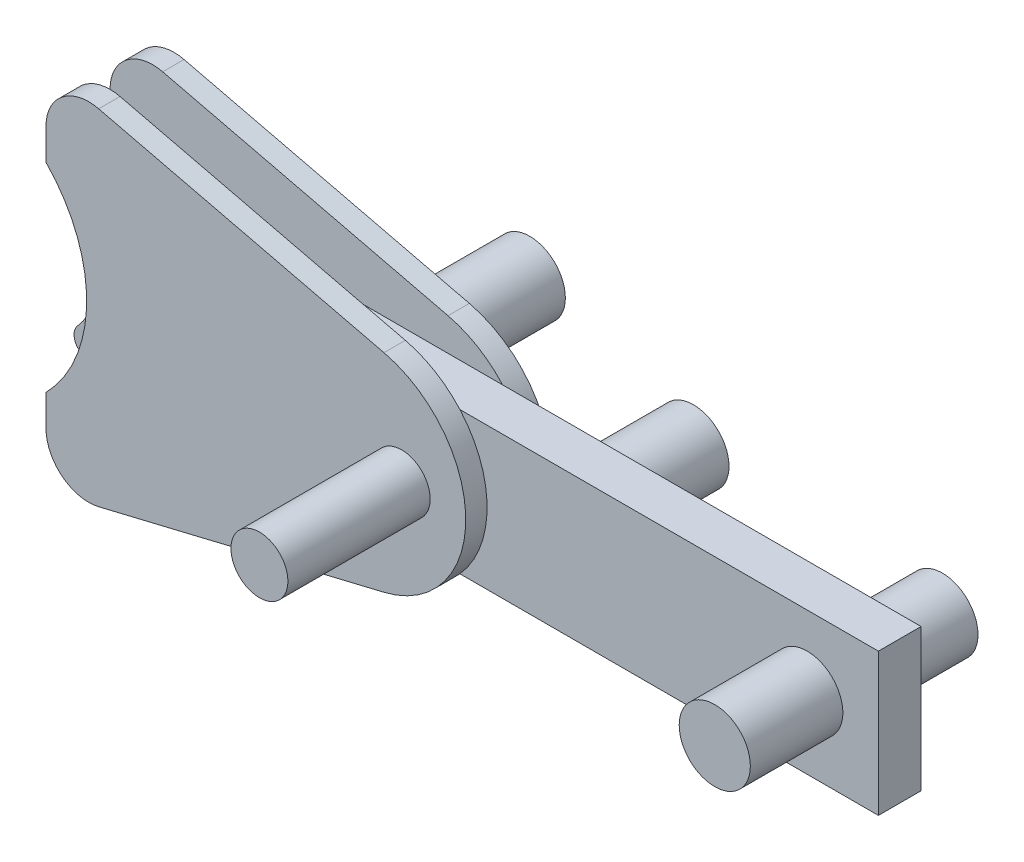
ISO-10303-21;
HEADER;
FILE_DESCRIPTION(('STEP AP214'),'2;1');
FILE_NAME('part.step','',(''),(''),'','','');
FILE_SCHEMA(('AUTOMOTIVE_DESIGN { 1 0 10303 214 1 1 1 1 }'));
ENDSEC;
DATA;
#1=APPLICATION_CONTEXT('core data for automotive mechanical design processes');
#2=APPLICATION_PROTOCOL_DEFINITION('international standard','automotive_design',2000,#1);
#3=PRODUCT_CONTEXT('',#1,'mechanical');
#4=PRODUCT('Part','Part','',(#3));
#5=PRODUCT_RELATED_PRODUCT_CATEGORY('part','',(#4));
#6=PRODUCT_DEFINITION_FORMATION('','',#4);
#7=PRODUCT_DEFINITION_CONTEXT('part definition',#1,'design');
#8=PRODUCT_DEFINITION('design','',#6,#7);
#9=PRODUCT_DEFINITION_SHAPE('','',#8);
#10=(LENGTH_UNIT() NAMED_UNIT(*) SI_UNIT(.MILLI.,.METRE.));
#11=(NAMED_UNIT(*) PLANE_ANGLE_UNIT() SI_UNIT($,.RADIAN.));
#12=(NAMED_UNIT(*) SI_UNIT($,.STERADIAN.) SOLID_ANGLE_UNIT());
#13=UNCERTAINTY_MEASURE_WITH_UNIT(LENGTH_MEASURE(1.E-05),#10,'distance_accuracy_value','');
#14=(GEOMETRIC_REPRESENTATION_CONTEXT(3) GLOBAL_UNCERTAINTY_ASSIGNED_CONTEXT((#13)) GLOBAL_UNIT_ASSIGNED_CONTEXT((#10,
#11,#12)) REPRESENTATION_CONTEXT('',''));
#15=CARTESIAN_POINT('',(0.,0.,0.));
#16=DIRECTION('',(0.,0.,1.));
#17=DIRECTION('',(1.,0.,0.));
#18=AXIS2_PLACEMENT_3D('',#15,#16,#17);
#19=CARTESIAN_POINT('',(-35.,0.,-1.5));
#20=DIRECTION('',(0.,0.,1.));
#21=DIRECTION('',(-1.,0.,0.));
#22=AXIS2_PLACEMENT_3D('',#19,#20,#21);
#23=PLANE('',#22);
#24=DIRECTION('',(1.,0.,0.));
#25=VECTOR('',#24,1.);
#26=CARTESIAN_POINT('',(-35.,-5.,-1.5));
#27=LINE('',#26,#25);
#28=CARTESIAN_POINT('',(-30.5278640450004,-5.,-1.5));
#29=VERTEX_POINT('',#28);
#30=CARTESIAN_POINT('',(-30.4811743906985,-5.,-1.5));
#31=VERTEX_POINT('',#30);
#32=EDGE_CURVE('E328',#29,#31,#27,.T.);
#33=ORIENTED_EDGE('',*,*,#32,.F.);
#34=CARTESIAN_POINT('',(-30.5278640450004,-4.,-1.5));
#35=DIRECTION('',(0.,0.,1.));
#36=DIRECTION('',(1.,0.,0.));
#37=AXIS2_PLACEMENT_3D('',#34,#35,#36);
#38=CIRCLE('',#37,1.);
#39=CARTESIAN_POINT('',(-31.2732200375004,-3.33333333333333,-1.5));
#40=VERTEX_POINT('',#39);
#41=EDGE_CURVE('E463',#29,#40,#38,.F.);
#42=ORIENTED_EDGE('',*,*,#41,.T.);
#43=CARTESIAN_POINT('',(-35.,0.,-1.5));
#44=DIRECTION('',(0.,0.,-1.));
#45=DIRECTION('',(-1.,0.,0.));
#46=AXIS2_PLACEMENT_3D('',#43,#44,#45);
#47=CIRCLE('',#46,5.);
#48=CARTESIAN_POINT('',(-31.2732200375004,3.33333333333333,-1.5));
#49=VERTEX_POINT('',#48);
#50=EDGE_CURVE('E331',#49,#40,#47,.T.);
#51=ORIENTED_EDGE('',*,*,#50,.F.);
#52=CARTESIAN_POINT('',(-30.5278640450004,4.,-1.5));
#53=DIRECTION('',(0.,0.,1.));
#54=DIRECTION('',(1.,0.,0.));
#55=AXIS2_PLACEMENT_3D('',#52,#53,#54);
#56=CIRCLE('',#55,1.);
#57=CARTESIAN_POINT('',(-30.5278640450004,5.,-1.5));
#58=VERTEX_POINT('',#57);
#59=EDGE_CURVE('E460',#49,#58,#56,.F.);
#60=ORIENTED_EDGE('',*,*,#59,.T.);
#61=DIRECTION('',(-1.,0.,0.));
#62=VECTOR('',#61,1.);
#63=CARTESIAN_POINT('',(-35.,5.,-1.5));
#64=LINE('',#63,#62);
#65=CARTESIAN_POINT('',(-30.4811743906985,5.,-1.5));
#66=VERTEX_POINT('',#65);
#67=EDGE_CURVE('E335',#66,#58,#64,.T.);
#68=ORIENTED_EDGE('',*,*,#67,.F.);
#69=CARTESIAN_POINT('',(-39.1414284285429,0.,-1.5));
#70=DIRECTION('',(0.,0.,-1.));
#71=DIRECTION('',(-1.,0.,0.));
#72=AXIS2_PLACEMENT_3D('',#69,#70,#71);
#73=CIRCLE('',#72,10.);
#74=EDGE_CURVE('E276',#66,#31,#73,.T.);
#75=ORIENTED_EDGE('',*,*,#74,.T.);
#76=EDGE_LOOP('',(#33,#42,#51,#60,#68,#75));
#77=FACE_BOUND('',#76,.T.);
#78=ADVANCED_FACE('F39',(#77),#23,.F.);
#79=CARTESIAN_POINT('',(-35.,0.,1.5));
#80=DIRECTION('',(0.,0.,-1.));
#81=DIRECTION('',(-1.,0.,0.));
#82=AXIS2_PLACEMENT_3D('',#79,#80,#81);
#83=PLANE('',#82);
#84=CARTESIAN_POINT('',(-35.,0.,1.5));
#85=DIRECTION('',(0.,0.,-1.));
#86=DIRECTION('',(-1.,0.,0.));
#87=AXIS2_PLACEMENT_3D('',#84,#85,#86);
#88=CIRCLE('',#87,5.);
#89=CARTESIAN_POINT('',(-31.2732200375004,3.33333333333333,1.5));
#90=VERTEX_POINT('',#89);
#91=CARTESIAN_POINT('',(-31.2732200375004,-3.33333333333333,1.5));
#92=VERTEX_POINT('',#91);
#93=EDGE_CURVE('E436',#90,#92,#88,.T.);
#94=ORIENTED_EDGE('',*,*,#93,.T.);
#95=CARTESIAN_POINT('',(-30.5278640450004,-4.,1.5));
#96=DIRECTION('',(0.,0.,-1.));
#97=DIRECTION('',(-1.,0.,0.));
#98=AXIS2_PLACEMENT_3D('',#95,#96,#97);
#99=CIRCLE('',#98,1.);
#100=CARTESIAN_POINT('',(-30.5278640450004,-5.,1.5));
#101=VERTEX_POINT('',#100);
#102=EDGE_CURVE('E475',#92,#101,#99,.F.);
#103=ORIENTED_EDGE('',*,*,#102,.T.);
#104=DIRECTION('',(1.,0.,0.));
#105=VECTOR('',#104,1.);
#106=CARTESIAN_POINT('',(-35.,-5.,1.5));
#107=LINE('',#106,#105);
#108=CARTESIAN_POINT('',(-30.4811743906985,-5.,1.5));
#109=VERTEX_POINT('',#108);
#110=EDGE_CURVE('E441',#101,#109,#107,.T.);
#111=ORIENTED_EDGE('',*,*,#110,.T.);
#112=CARTESIAN_POINT('',(-39.1414284285429,0.,1.5));
#113=DIRECTION('',(0.,0.,-1.));
#114=DIRECTION('',(-1.,0.,0.));
#115=AXIS2_PLACEMENT_3D('',#112,#113,#114);
#116=CIRCLE('',#115,10.);
#117=CARTESIAN_POINT('',(-30.4811743906985,5.,1.5));
#118=VERTEX_POINT('',#117);
#119=EDGE_CURVE('E374',#118,#109,#116,.T.);
#120=ORIENTED_EDGE('',*,*,#119,.F.);
#121=DIRECTION('',(-1.,0.,0.));
#122=VECTOR('',#121,1.);
#123=CARTESIAN_POINT('',(-35.,5.,1.5));
#124=LINE('',#123,#122);
#125=CARTESIAN_POINT('',(-30.5278640450004,5.,1.5));
#126=VERTEX_POINT('',#125);
#127=EDGE_CURVE('E432',#118,#126,#124,.T.);
#128=ORIENTED_EDGE('',*,*,#127,.T.);
#129=CARTESIAN_POINT('',(-30.5278640450004,4.,1.5));
#130=DIRECTION('',(0.,0.,-1.));
#131=DIRECTION('',(-1.,0.,0.));
#132=AXIS2_PLACEMENT_3D('',#129,#130,#131);
#133=CIRCLE('',#132,1.);
#134=EDGE_CURVE('E472',#126,#90,#133,.F.);
#135=ORIENTED_EDGE('',*,*,#134,.T.);
#136=EDGE_LOOP('',(#94,#103,#111,#120,#128,#135));
#137=FACE_BOUND('',#136,.T.);
#138=ADVANCED_FACE('F505',(#137),#83,.F.);
#139=CARTESIAN_POINT('',(25.,5.00000000000001,1.5));
#140=DIRECTION('',(-1.,0.,0.));
#141=DIRECTION('',(0.,0.,1.));
#142=AXIS2_PLACEMENT_3D('',#139,#140,#141);
#143=PLANE('',#142);
#144=DIRECTION('',(0.,0.,-1.));
#145=VECTOR('',#144,1.);
#146=CARTESIAN_POINT('',(25.,-4.99999999999999,1.5));
#147=LINE('',#146,#145);
#148=CARTESIAN_POINT('',(25.,-4.99999999999999,1.5));
#149=VERTEX_POINT('',#148);
#150=CARTESIAN_POINT('',(25.,-4.99999999999999,-1.5));
#151=VERTEX_POINT('',#150);
#152=EDGE_CURVE('E444',#149,#151,#147,.T.);
#153=ORIENTED_EDGE('',*,*,#152,.T.);
#154=DIRECTION('',(0.,1.,0.));
#155=VECTOR('',#154,1.);
#156=CARTESIAN_POINT('',(25.,5.00000000000001,-1.5));
#157=LINE('',#156,#155);
#158=CARTESIAN_POINT('',(25.,5.00000000000001,-1.5));
#159=VERTEX_POINT('',#158);
#160=EDGE_CURVE('E230',#151,#159,#157,.T.);
#161=ORIENTED_EDGE('',*,*,#160,.T.);
#162=DIRECTION('',(0.,0.,-1.));
#163=VECTOR('',#162,1.);
#164=CARTESIAN_POINT('',(25.,5.00000000000001,1.5));
#165=LINE('',#164,#163);
#166=CARTESIAN_POINT('',(25.,5.00000000000001,1.5));
#167=VERTEX_POINT('',#166);
#168=EDGE_CURVE('E449',#167,#159,#165,.T.);
#169=ORIENTED_EDGE('',*,*,#168,.F.);
#170=DIRECTION('',(0.,1.,0.));
#171=VECTOR('',#170,1.);
#172=CARTESIAN_POINT('',(25.,5.00000000000001,1.5));
#173=LINE('',#172,#171);
#174=EDGE_CURVE('E428',#149,#167,#173,.T.);
#175=ORIENTED_EDGE('',*,*,#174,.F.);
#176=EDGE_LOOP('',(#153,#161,#169,#175));
#177=FACE_BOUND('',#176,.T.);
#178=ADVANCED_FACE('F512',(#177),#143,.F.);
#179=CARTESIAN_POINT('',(-35.,5.,1.5));
#180=DIRECTION('',(0.,-1.,0.));
#181=DIRECTION('',(1.,0.,0.));
#182=AXIS2_PLACEMENT_3D('',#179,#180,#181);
#183=PLANE('',#182);
#184=ORIENTED_EDGE('',*,*,#67,.T.);
#185=DIRECTION('',(0.,0.,-1.));
#186=VECTOR('',#185,1.);
#187=CARTESIAN_POINT('',(-30.5278640450004,5.,1.5));
#188=LINE('',#187,#186);
#189=EDGE_CURVE('E55',#58,#126,#188,.F.);
#190=ORIENTED_EDGE('',*,*,#189,.T.);
#191=ORIENTED_EDGE('',*,*,#127,.F.);
#192=CARTESIAN_POINT('',(-4.40983005625053,5.,1.5));
#193=VERTEX_POINT('',#192);
#194=EDGE_CURVE('E437',#193,#118,#124,.T.);
#195=ORIENTED_EDGE('',*,*,#194,.F.);
#196=EDGE_CURVE('E433',#167,#193,#124,.T.);
#197=ORIENTED_EDGE('',*,*,#196,.F.);
#198=ORIENTED_EDGE('',*,*,#168,.T.);
#199=CARTESIAN_POINT('',(-4.40983005625053,5.,-1.5));
#200=VERTEX_POINT('',#199);
#201=EDGE_CURVE('E336',#159,#200,#64,.T.);
#202=ORIENTED_EDGE('',*,*,#201,.T.);
#203=EDGE_CURVE('E341',#200,#66,#64,.T.);
#204=ORIENTED_EDGE('',*,*,#203,.T.);
#205=EDGE_LOOP('',(#184,#190,#191,#195,#197,#198,#202,#204));
#206=FACE_BOUND('',#205,.T.);
#207=ADVANCED_FACE('F682',(#206),#183,.F.);
#208=CARTESIAN_POINT('',(-35.,0.,1.5));
#209=DIRECTION('',(0.,0.,-1.));
#210=DIRECTION('',(-1.,0.,0.));
#211=AXIS2_PLACEMENT_3D('',#208,#209,#210);
#212=CYLINDRICAL_SURFACE('',#211,5.);
#213=ORIENTED_EDGE('',*,*,#50,.T.);
#214=DIRECTION('',(0.,0.,-1.));
#215=VECTOR('',#214,1.);
#216=CARTESIAN_POINT('',(-31.2732200375004,-3.33333333333333,1.5));
#217=LINE('',#216,#215);
#218=EDGE_CURVE('E63',#40,#92,#217,.F.);
#219=ORIENTED_EDGE('',*,*,#218,.T.);
#220=ORIENTED_EDGE('',*,*,#93,.F.);
#221=DIRECTION('',(0.,0.,-1.));
#222=VECTOR('',#221,1.);
#223=CARTESIAN_POINT('',(-31.2732200375004,3.33333333333333,1.5));
#224=LINE('',#223,#222);
#225=EDGE_CURVE('E466',#90,#49,#224,.T.);
#226=ORIENTED_EDGE('',*,*,#225,.T.);
#227=EDGE_LOOP('',(#213,#219,#220,#226));
#228=FACE_BOUND('',#227,.T.);
#229=ADVANCED_FACE('F686',(#228),#212,.F.);
#230=CARTESIAN_POINT('',(-35.,-5.,1.5));
#231=DIRECTION('',(0.,1.,0.));
#232=DIRECTION('',(-1.,0.,0.));
#233=AXIS2_PLACEMENT_3D('',#230,#231,#232);
#234=PLANE('',#233);
#235=ORIENTED_EDGE('',*,*,#110,.F.);
#236=DIRECTION('',(0.,0.,-1.));
#237=VECTOR('',#236,1.);
#238=CARTESIAN_POINT('',(-30.5278640450004,-5.,1.5));
#239=LINE('',#238,#237);
#240=EDGE_CURVE('E456',#101,#29,#239,.T.);
#241=ORIENTED_EDGE('',*,*,#240,.T.);
#242=ORIENTED_EDGE('',*,*,#32,.T.);
#243=CARTESIAN_POINT('',(-4.40983005625052,-5.,-1.5));
#244=VERTEX_POINT('',#243);
#245=EDGE_CURVE('E332',#31,#244,#27,.T.);
#246=ORIENTED_EDGE('',*,*,#245,.T.);
#247=EDGE_CURVE('E327',#244,#151,#27,.T.);
#248=ORIENTED_EDGE('',*,*,#247,.T.);
#249=ORIENTED_EDGE('',*,*,#152,.F.);
#250=CARTESIAN_POINT('',(-4.40983005625052,-5.,1.5));
#251=VERTEX_POINT('',#250);
#252=EDGE_CURVE('E440',#251,#149,#107,.T.);
#253=ORIENTED_EDGE('',*,*,#252,.F.);
#254=EDGE_CURVE('E445',#109,#251,#107,.T.);
#255=ORIENTED_EDGE('',*,*,#254,.F.);
#256=EDGE_LOOP('',(#235,#241,#242,#246,#248,#249,#253,#255));
#257=FACE_BOUND('',#256,.T.);
#258=ADVANCED_FACE('F547',(#257),#234,.F.);
#259=CARTESIAN_POINT('',(20.,0.,1.5));
#260=DIRECTION('',(0.,0.,-1.));
#261=DIRECTION('',(-1.,0.,0.));
#262=AXIS2_PLACEMENT_3D('',#259,#260,#261);
#263=CIRCLE('',#262,2.5);
#264=CARTESIAN_POINT('',(17.5,0.,1.5));
#265=VERTEX_POINT('',#264);
#266=EDGE_CURVE('E452',#265,#265,#263,.F.);
#267=ORIENTED_EDGE('',*,*,#266,.F.);
#268=EDGE_LOOP('',(#267));
#269=FACE_BOUND('',#268,.T.);
#270=CARTESIAN_POINT('',(-10.,0.,1.5));
#271=DIRECTION('',(0.,0.,1.));
#272=DIRECTION('',(1.,0.,0.));
#273=AXIS2_PLACEMENT_3D('',#270,#271,#272);
#274=CIRCLE('',#273,7.5);
#275=EDGE_CURVE('E389',#251,#193,#274,.T.);
#276=ORIENTED_EDGE('',*,*,#275,.F.);
#277=ORIENTED_EDGE('',*,*,#252,.T.);
#278=ORIENTED_EDGE('',*,*,#174,.T.);
#279=ORIENTED_EDGE('',*,*,#196,.T.);
#280=EDGE_LOOP('',(#276,#277,#278,#279));
#281=FACE_BOUND('',#280,.T.);
#282=ADVANCED_FACE('F515',(#269,#281),#83,.F.);
#283=CARTESIAN_POINT('',(-39.1414284285429,0.,1.5));
#284=DIRECTION('',(0.,0.,-1.));
#285=DIRECTION('',(-1.,0.,0.));
#286=AXIS2_PLACEMENT_3D('',#283,#284,#285);
#287=PLANE('',#286);
#288=CARTESIAN_POINT('',(-8.24766380925009,7.29241509203831,1.5));
#289=VERTEX_POINT('',#288);
#290=EDGE_CURVE('E383',#193,#289,#274,.T.);
#291=ORIENTED_EDGE('',*,*,#290,.F.);
#292=ORIENTED_EDGE('',*,*,#194,.T.);
#293=CARTESIAN_POINT('',(-32.,7.,1.5));
#294=VERTEX_POINT('',#293);
#295=EDGE_CURVE('E369',#294,#118,#116,.T.);
#296=ORIENTED_EDGE('',*,*,#295,.F.);
#297=DIRECTION('',(0.,-1.,0.));
#298=VECTOR('',#297,1.);
#299=CARTESIAN_POINT('',(-32.,7.,1.5));
#300=LINE('',#299,#298);
#301=CARTESIAN_POINT('',(-32.,9.19371522027673,1.5));
#302=VERTEX_POINT('',#301);
#303=EDGE_CURVE('E347',#302,#294,#300,.T.);
#304=ORIENTED_EDGE('',*,*,#303,.F.);
#305=CARTESIAN_POINT('',(-29.,9.19371522027673,1.5));
#306=DIRECTION('',(0.,0.,1.));
#307=DIRECTION('',(1.,0.,0.));
#308=AXIS2_PLACEMENT_3D('',#305,#306,#307);
#309=CIRCLE('',#308,3.);
#310=CARTESIAN_POINT('',(-28.2990655237,12.1106812570921,1.5));
#311=VERTEX_POINT('',#310);
#312=EDGE_CURVE('E392',#311,#302,#309,.T.);
#313=ORIENTED_EDGE('',*,*,#312,.F.);
#314=DIRECTION('',(-0.972322012271774,0.233644825433321,0.));
#315=VECTOR('',#314,1.);
#316=CARTESIAN_POINT('',(-28.2990655237,12.1106812570921,1.5));
#317=LINE('',#316,#315);
#318=EDGE_CURVE('E388',#289,#311,#317,.T.);
#319=ORIENTED_EDGE('',*,*,#318,.F.);
#320=EDGE_LOOP('',(#291,#292,#296,#304,#313,#319));
#321=FACE_BOUND('',#320,.T.);
#322=ADVANCED_FACE('F680',(#321),#287,.T.);
#323=CARTESIAN_POINT('',(-39.1414284285429,0.,3.));
#324=DIRECTION('',(0.,0.,-1.));
#325=DIRECTION('',(-1.,0.,0.));
#326=AXIS2_PLACEMENT_3D('',#323,#324,#325);
#327=CYLINDRICAL_SURFACE('',#326,10.);
#328=ORIENTED_EDGE('',*,*,#295,.T.);
#329=ORIENTED_EDGE('',*,*,#119,.T.);
#330=CARTESIAN_POINT('',(-32.,-7.,1.5));
#331=VERTEX_POINT('',#330);
#332=EDGE_CURVE('E340',#109,#331,#116,.T.);
#333=ORIENTED_EDGE('',*,*,#332,.T.);
#334=DIRECTION('',(0.,0.,-1.));
#335=VECTOR('',#334,1.);
#336=CARTESIAN_POINT('',(-32.,-7.,3.));
#337=LINE('',#336,#335);
#338=CARTESIAN_POINT('',(-32.,-7.,3.));
#339=VERTEX_POINT('',#338);
#340=EDGE_CURVE('E424',#339,#331,#337,.T.);
#341=ORIENTED_EDGE('',*,*,#340,.F.);
#342=CARTESIAN_POINT('',(-39.1414284285429,0.,3.));
#343=DIRECTION('',(0.,0.,-1.));
#344=DIRECTION('',(-1.,0.,0.));
#345=AXIS2_PLACEMENT_3D('',#342,#343,#344);
#346=CIRCLE('',#345,10.);
#347=CARTESIAN_POINT('',(-32.,7.,3.));
#348=VERTEX_POINT('',#347);
#349=EDGE_CURVE('E342',#348,#339,#346,.T.);
#350=ORIENTED_EDGE('',*,*,#349,.F.);
#351=DIRECTION('',(0.,0.,-1.));
#352=VECTOR('',#351,1.);
#353=CARTESIAN_POINT('',(-32.,7.,3.));
#354=LINE('',#353,#352);
#355=EDGE_CURVE('E368',#348,#294,#354,.T.);
#356=ORIENTED_EDGE('',*,*,#355,.T.);
#357=EDGE_LOOP('',(#328,#329,#333,#341,#350,#356));
#358=FACE_BOUND('',#357,.T.);
#359=ADVANCED_FACE('F645',(#358),#327,.F.);
#360=CARTESIAN_POINT('',(-32.,-9.19371522027672,3.));
#361=DIRECTION('',(1.,0.,0.));
#362=DIRECTION('',(0.,0.,-1.));
#363=AXIS2_PLACEMENT_3D('',#360,#361,#362);
#364=PLANE('',#363);
#365=DIRECTION('',(0.,-1.,0.));
#366=VECTOR('',#365,1.);
#367=CARTESIAN_POINT('',(-32.,-9.19371522027672,1.5));
#368=LINE('',#367,#366);
#369=CARTESIAN_POINT('',(-32.,-9.19371522027672,1.5));
#370=VERTEX_POINT('',#369);
#371=EDGE_CURVE('E373',#331,#370,#368,.T.);
#372=ORIENTED_EDGE('',*,*,#371,.T.);
#373=DIRECTION('',(0.,0.,-1.));
#374=VECTOR('',#373,1.);
#375=CARTESIAN_POINT('',(-32.,-9.19371522027672,3.));
#376=LINE('',#375,#374);
#377=CARTESIAN_POINT('',(-32.,-9.19371522027672,3.));
#378=VERTEX_POINT('',#377);
#379=EDGE_CURVE('E420',#378,#370,#376,.T.);
#380=ORIENTED_EDGE('',*,*,#379,.F.);
#381=DIRECTION('',(0.,-1.,0.));
#382=VECTOR('',#381,1.);
#383=CARTESIAN_POINT('',(-32.,-9.19371522027672,3.));
#384=LINE('',#383,#382);
#385=EDGE_CURVE('E346',#339,#378,#384,.T.);
#386=ORIENTED_EDGE('',*,*,#385,.F.);
#387=ORIENTED_EDGE('',*,*,#340,.T.);
#388=EDGE_LOOP('',(#372,#380,#386,#387));
#389=FACE_BOUND('',#388,.T.);
#390=ADVANCED_FACE('F649',(#389),#364,.F.);
#391=CARTESIAN_POINT('',(-29.,-9.19371522027672,3.));
#392=DIRECTION('',(0.,0.,-1.));
#393=DIRECTION('',(-1.,0.,0.));
#394=AXIS2_PLACEMENT_3D('',#391,#392,#393);
#395=CYLINDRICAL_SURFACE('',#394,3.);
#396=CARTESIAN_POINT('',(-29.,-9.19371522027672,1.5));
#397=DIRECTION('',(0.,0.,1.));
#398=DIRECTION('',(1.,0.,0.));
#399=AXIS2_PLACEMENT_3D('',#396,#397,#398);
#400=CIRCLE('',#399,3.);
#401=CARTESIAN_POINT('',(-28.2990655237,-12.1106812570921,1.5));
#402=VERTEX_POINT('',#401);
#403=EDGE_CURVE('E377',#370,#402,#400,.T.);
#404=ORIENTED_EDGE('',*,*,#403,.T.);
#405=DIRECTION('',(0.,0.,-1.));
#406=VECTOR('',#405,1.);
#407=CARTESIAN_POINT('',(-28.2990655237,-12.1106812570921,3.));
#408=LINE('',#407,#406);
#409=CARTESIAN_POINT('',(-28.2990655237,-12.1106812570921,3.));
#410=VERTEX_POINT('',#409);
#411=EDGE_CURVE('E416',#410,#402,#408,.T.);
#412=ORIENTED_EDGE('',*,*,#411,.F.);
#413=CARTESIAN_POINT('',(-29.,-9.19371522027672,3.));
#414=DIRECTION('',(0.,0.,1.));
#415=DIRECTION('',(1.,0.,0.));
#416=AXIS2_PLACEMENT_3D('',#413,#414,#415);
#417=CIRCLE('',#416,3.);
#418=EDGE_CURVE('E350',#378,#410,#417,.T.);
#419=ORIENTED_EDGE('',*,*,#418,.F.);
#420=ORIENTED_EDGE('',*,*,#379,.T.);
#421=EDGE_LOOP('',(#404,#412,#419,#420));
#422=FACE_BOUND('',#421,.T.);
#423=ADVANCED_FACE('F654',(#422),#395,.T.);
#424=CARTESIAN_POINT('',(-28.2990655237,-12.1106812570921,3.));
#425=DIRECTION('',(-0.233644825433321,0.972322012271775,0.));
#426=DIRECTION('',(-0.972322012271774,-0.233644825433321,0.));
#427=AXIS2_PLACEMENT_3D('',#424,#425,#426);
#428=PLANE('',#427);
#429=DIRECTION('',(0.972322012271774,0.233644825433321,0.));
#430=VECTOR('',#429,1.);
#431=CARTESIAN_POINT('',(-28.2990655237,-12.1106812570921,1.5));
#432=LINE('',#431,#430);
#433=CARTESIAN_POINT('',(-8.24766380925009,-7.29241509203831,1.5));
#434=VERTEX_POINT('',#433);
#435=EDGE_CURVE('E380',#402,#434,#432,.T.);
#436=ORIENTED_EDGE('',*,*,#435,.T.);
#437=DIRECTION('',(0.,0.,-1.));
#438=VECTOR('',#437,1.);
#439=CARTESIAN_POINT('',(-8.24766380925009,-7.29241509203831,3.));
#440=LINE('',#439,#438);
#441=CARTESIAN_POINT('',(-8.24766380925009,-7.29241509203831,3.));
#442=VERTEX_POINT('',#441);
#443=EDGE_CURVE('E412',#442,#434,#440,.T.);
#444=ORIENTED_EDGE('',*,*,#443,.F.);
#445=DIRECTION('',(0.972322012271774,0.233644825433321,0.));
#446=VECTOR('',#445,1.);
#447=CARTESIAN_POINT('',(-28.2990655237,-12.1106812570921,3.));
#448=LINE('',#447,#446);
#449=EDGE_CURVE('E353',#410,#442,#448,.T.);
#450=ORIENTED_EDGE('',*,*,#449,.F.);
#451=ORIENTED_EDGE('',*,*,#411,.T.);
#452=EDGE_LOOP('',(#436,#444,#450,#451));
#453=FACE_BOUND('',#452,.T.);
#454=ADVANCED_FACE('F660',(#453),#428,.F.);
#455=CARTESIAN_POINT('',(-10.,0.,3.));
#456=DIRECTION('',(0.,0.,-1.));
#457=DIRECTION('',(-1.,0.,0.));
#458=AXIS2_PLACEMENT_3D('',#455,#456,#457);
#459=CYLINDRICAL_SURFACE('',#458,7.5);
#460=EDGE_CURVE('E384',#434,#251,#274,.T.);
#461=ORIENTED_EDGE('',*,*,#460,.T.);
#462=ORIENTED_EDGE('',*,*,#275,.T.);
#463=ORIENTED_EDGE('',*,*,#290,.T.);
#464=DIRECTION('',(0.,0.,-1.));
#465=VECTOR('',#464,1.);
#466=CARTESIAN_POINT('',(-8.24766380925009,7.29241509203831,3.));
#467=LINE('',#466,#465);
#468=CARTESIAN_POINT('',(-8.24766380925009,7.29241509203831,3.));
#469=VERTEX_POINT('',#468);
#470=EDGE_CURVE('E408',#469,#289,#467,.T.);
#471=ORIENTED_EDGE('',*,*,#470,.F.);
#472=CARTESIAN_POINT('',(-10.,0.,3.));
#473=DIRECTION('',(0.,0.,1.));
#474=DIRECTION('',(1.,0.,0.));
#475=AXIS2_PLACEMENT_3D('',#472,#473,#474);
#476=CIRCLE('',#475,7.5);
#477=EDGE_CURVE('E356',#442,#469,#476,.T.);
#478=ORIENTED_EDGE('',*,*,#477,.F.);
#479=ORIENTED_EDGE('',*,*,#443,.T.);
#480=EDGE_LOOP('',(#461,#462,#463,#471,#478,#479));
#481=FACE_BOUND('',#480,.T.);
#482=ADVANCED_FACE('F664',(#481),#459,.T.);
#483=CARTESIAN_POINT('',(-28.2990655237,12.1106812570921,3.));
#484=DIRECTION('',(-0.233644825433321,-0.972322012271775,0.));
#485=DIRECTION('',(0.972322012271774,-0.233644825433321,0.));
#486=AXIS2_PLACEMENT_3D('',#483,#484,#485);
#487=PLANE('',#486);
#488=ORIENTED_EDGE('',*,*,#318,.T.);
#489=DIRECTION('',(0.,0.,-1.));
#490=VECTOR('',#489,1.);
#491=CARTESIAN_POINT('',(-28.2990655237,12.1106812570921,3.));
#492=LINE('',#491,#490);
#493=CARTESIAN_POINT('',(-28.2990655237,12.1106812570921,3.));
#494=VERTEX_POINT('',#493);
#495=EDGE_CURVE('E404',#494,#311,#492,.T.);
#496=ORIENTED_EDGE('',*,*,#495,.F.);
#497=DIRECTION('',(-0.972322012271774,0.233644825433321,0.));
#498=VECTOR('',#497,1.);
#499=CARTESIAN_POINT('',(-28.2990655237,12.1106812570921,3.));
#500=LINE('',#499,#498);
#501=EDGE_CURVE('E359',#469,#494,#500,.T.);
#502=ORIENTED_EDGE('',*,*,#501,.F.);
#503=ORIENTED_EDGE('',*,*,#470,.T.);
#504=EDGE_LOOP('',(#488,#496,#502,#503));
#505=FACE_BOUND('',#504,.T.);
#506=ADVANCED_FACE('F670',(#505),#487,.F.);
#507=CARTESIAN_POINT('',(-29.,9.19371522027673,3.));
#508=DIRECTION('',(0.,0.,-1.));
#509=DIRECTION('',(-1.,0.,0.));
#510=AXIS2_PLACEMENT_3D('',#507,#508,#509);
#511=CYLINDRICAL_SURFACE('',#510,3.);
#512=ORIENTED_EDGE('',*,*,#312,.T.);
#513=DIRECTION('',(0.,0.,-1.));
#514=VECTOR('',#513,1.);
#515=CARTESIAN_POINT('',(-32.,9.19371522027673,3.));
#516=LINE('',#515,#514);
#517=CARTESIAN_POINT('',(-32.,9.19371522027673,3.));
#518=VERTEX_POINT('',#517);
#519=EDGE_CURVE('E400',#518,#302,#516,.T.);
#520=ORIENTED_EDGE('',*,*,#519,.F.);
#521=CARTESIAN_POINT('',(-29.,9.19371522027673,3.));
#522=DIRECTION('',(0.,0.,1.));
#523=DIRECTION('',(1.,0.,0.));
#524=AXIS2_PLACEMENT_3D('',#521,#522,#523);
#525=CIRCLE('',#524,3.);
#526=EDGE_CURVE('E362',#494,#518,#525,.T.);
#527=ORIENTED_EDGE('',*,*,#526,.F.);
#528=ORIENTED_EDGE('',*,*,#495,.T.);
#529=EDGE_LOOP('',(#512,#520,#527,#528));
#530=FACE_BOUND('',#529,.T.);
#531=ADVANCED_FACE('F674',(#530),#511,.T.);
#532=CARTESIAN_POINT('',(-32.,7.,3.));
#533=DIRECTION('',(1.,0.,0.));
#534=DIRECTION('',(0.,1.,0.));
#535=AXIS2_PLACEMENT_3D('',#532,#533,#534);
#536=PLANE('',#535);
#537=ORIENTED_EDGE('',*,*,#303,.T.);
#538=ORIENTED_EDGE('',*,*,#355,.F.);
#539=DIRECTION('',(0.,-1.,0.));
#540=VECTOR('',#539,1.);
#541=CARTESIAN_POINT('',(-32.,7.,3.));
#542=LINE('',#541,#540);
#543=EDGE_CURVE('E365',#518,#348,#542,.T.);
#544=ORIENTED_EDGE('',*,*,#543,.F.);
#545=ORIENTED_EDGE('',*,*,#519,.T.);
#546=EDGE_LOOP('',(#537,#538,#544,#545));
#547=FACE_BOUND('',#546,.T.);
#548=ADVANCED_FACE('F637',(#547),#536,.F.);
#549=CARTESIAN_POINT('',(-39.1414284285429,0.,3.));
#550=DIRECTION('',(0.,0.,-1.));
#551=DIRECTION('',(-1.,0.,0.));
#552=AXIS2_PLACEMENT_3D('',#549,#550,#551);
#553=PLANE('',#552);
#554=CARTESIAN_POINT('',(-7.,0.,3.));
#555=DIRECTION('',(0.,0.,-1.));
#556=DIRECTION('',(-1.,0.,0.));
#557=AXIS2_PLACEMENT_3D('',#554,#555,#556);
#558=CIRCLE('',#557,2.);
#559=CARTESIAN_POINT('',(-9.,0.,3.));
#560=VERTEX_POINT('',#559);
#561=EDGE_CURVE('E480',#560,#560,#558,.F.);
#562=ORIENTED_EDGE('',*,*,#561,.F.);
#563=EDGE_LOOP('',(#562));
#564=FACE_BOUND('',#563,.T.);
#565=ORIENTED_EDGE('',*,*,#349,.T.);
#566=ORIENTED_EDGE('',*,*,#385,.T.);
#567=ORIENTED_EDGE('',*,*,#418,.T.);
#568=ORIENTED_EDGE('',*,*,#449,.T.);
#569=ORIENTED_EDGE('',*,*,#477,.T.);
#570=ORIENTED_EDGE('',*,*,#501,.T.);
#571=ORIENTED_EDGE('',*,*,#526,.T.);
#572=ORIENTED_EDGE('',*,*,#543,.T.);
#573=EDGE_LOOP('',(#565,#566,#567,#568,#569,#570,#571,#572));
#574=FACE_BOUND('',#573,.T.);
#575=ADVANCED_FACE('F634',(#564,#574),#553,.F.);
#576=ORIENTED_EDGE('',*,*,#332,.F.);
#577=ORIENTED_EDGE('',*,*,#254,.T.);
#578=ORIENTED_EDGE('',*,*,#460,.F.);
#579=ORIENTED_EDGE('',*,*,#435,.F.);
#580=ORIENTED_EDGE('',*,*,#403,.F.);
#581=ORIENTED_EDGE('',*,*,#371,.F.);
#582=EDGE_LOOP('',(#576,#577,#578,#579,#580,#581));
#583=FACE_BOUND('',#582,.T.);
#584=ADVANCED_FACE('F529',(#583),#287,.T.);
#585=CARTESIAN_POINT('',(20.,0.,3.));
#586=DIRECTION('',(0.,0.,-1.));
#587=DIRECTION('',(-1.,0.,0.));
#588=AXIS2_PLACEMENT_3D('',#585,#586,#587);
#589=CYLINDRICAL_SURFACE('',#588,2.5);
#590=ORIENTED_EDGE('',*,*,#266,.T.);
#591=EDGE_LOOP('',(#590));
#592=FACE_BOUND('',#591,.T.);
#593=CARTESIAN_POINT('',(20.,0.,8.));
#594=DIRECTION('',(0.,0.,1.));
#595=DIRECTION('',(1.,0.,0.));
#596=AXIS2_PLACEMENT_3D('',#593,#594,#595);
#597=CIRCLE('',#596,2.5);
#598=CARTESIAN_POINT('',(22.5,0.,8.));
#599=VERTEX_POINT('',#598);
#600=EDGE_CURVE('E580',#599,#599,#597,.T.);
#601=ORIENTED_EDGE('',*,*,#600,.F.);
#602=EDGE_LOOP('',(#601));
#603=FACE_BOUND('',#602,.T.);
#604=ADVANCED_FACE('F521',(#592,#603),#589,.T.);
#605=CARTESIAN_POINT('',(1.,0.,-1.5));
#606=DIRECTION('',(0.,0.,1.));
#607=DIRECTION('',(1.,0.,0.));
#608=AXIS2_PLACEMENT_3D('',#605,#606,#607);
#609=CIRCLE('',#608,2.5);
#610=CARTESIAN_POINT('',(3.5,0.,-1.5));
#611=VERTEX_POINT('',#610);
#612=EDGE_CURVE('E11',#611,#611,#609,.F.);
#613=ORIENTED_EDGE('',*,*,#612,.F.);
#614=EDGE_LOOP('',(#613));
#615=FACE_BOUND('',#614,.T.);
#616=CARTESIAN_POINT('',(20.,0.,-1.5));
#617=DIRECTION('',(0.,0.,1.));
#618=DIRECTION('',(1.,0.,0.));
#619=AXIS2_PLACEMENT_3D('',#616,#617,#618);
#620=CIRCLE('',#619,2.5);
#621=CARTESIAN_POINT('',(22.5,0.,-1.5));
#622=VERTEX_POINT('',#621);
#623=EDGE_CURVE('E536',#622,#622,#620,.T.);
#624=ORIENTED_EDGE('',*,*,#623,.T.);
#625=EDGE_LOOP('',(#624));
#626=FACE_BOUND('',#625,.T.);
#627=ORIENTED_EDGE('',*,*,#247,.F.);
#628=CARTESIAN_POINT('',(-10.,0.,-1.5));
#629=DIRECTION('',(0.,0.,1.));
#630=DIRECTION('',(1.,0.,0.));
#631=AXIS2_PLACEMENT_3D('',#628,#629,#630);
#632=CIRCLE('',#631,7.5);
#633=EDGE_CURVE('E293',#244,#200,#632,.T.);
#634=ORIENTED_EDGE('',*,*,#633,.T.);
#635=ORIENTED_EDGE('',*,*,#201,.F.);
#636=ORIENTED_EDGE('',*,*,#160,.F.);
#637=EDGE_LOOP('',(#627,#634,#635,#636));
#638=FACE_BOUND('',#637,.T.);
#639=ADVANCED_FACE('F508',(#615,#626,#638),#23,.F.);
#640=CARTESIAN_POINT('',(-39.1414284285429,0.,-1.5));
#641=DIRECTION('',(0.,0.,1.));
#642=DIRECTION('',(-1.,0.,0.));
#643=AXIS2_PLACEMENT_3D('',#640,#641,#642);
#644=PLANE('',#643);
#645=ORIENTED_EDGE('',*,*,#245,.F.);
#646=CARTESIAN_POINT('',(-32.,-7.,-1.5));
#647=VERTEX_POINT('',#646);
#648=EDGE_CURVE('E275',#31,#647,#73,.T.);
#649=ORIENTED_EDGE('',*,*,#648,.T.);
#650=DIRECTION('',(0.,-1.,0.));
#651=VECTOR('',#650,1.);
#652=CARTESIAN_POINT('',(-32.,-9.19371522027672,-1.5));
#653=LINE('',#652,#651);
#654=CARTESIAN_POINT('',(-32.,-9.19371522027672,-1.5));
#655=VERTEX_POINT('',#654);
#656=EDGE_CURVE('E243',#647,#655,#653,.T.);
#657=ORIENTED_EDGE('',*,*,#656,.T.);
#658=CARTESIAN_POINT('',(-29.,-9.19371522027672,-1.5));
#659=DIRECTION('',(0.,0.,1.));
#660=DIRECTION('',(1.,0.,0.));
#661=AXIS2_PLACEMENT_3D('',#658,#659,#660);
#662=CIRCLE('',#661,3.);
#663=CARTESIAN_POINT('',(-28.2990655237,-12.1106812570921,-1.5));
#664=VERTEX_POINT('',#663);
#665=EDGE_CURVE('E297',#655,#664,#662,.T.);
#666=ORIENTED_EDGE('',*,*,#665,.T.);
#667=DIRECTION('',(0.972322012271774,0.233644825433321,0.));
#668=VECTOR('',#667,1.);
#669=CARTESIAN_POINT('',(-28.2990655237,-12.1106812570921,-1.5));
#670=LINE('',#669,#668);
#671=CARTESIAN_POINT('',(-8.24766380925009,-7.29241509203831,-1.5));
#672=VERTEX_POINT('',#671);
#673=EDGE_CURVE('E292',#664,#672,#670,.T.);
#674=ORIENTED_EDGE('',*,*,#673,.T.);
#675=EDGE_CURVE('E288',#672,#244,#632,.T.);
#676=ORIENTED_EDGE('',*,*,#675,.T.);
#677=EDGE_LOOP('',(#645,#649,#657,#666,#674,#676));
#678=FACE_BOUND('',#677,.T.);
#679=ADVANCED_FACE('F520',(#678),#644,.T.);
#680=ORIENTED_EDGE('',*,*,#203,.F.);
#681=CARTESIAN_POINT('',(-8.24766380925009,7.29241509203831,-1.5));
#682=VERTEX_POINT('',#681);
#683=EDGE_CURVE('E287',#200,#682,#632,.T.);
#684=ORIENTED_EDGE('',*,*,#683,.T.);
#685=DIRECTION('',(-0.972322012271774,0.233644825433321,0.));
#686=VECTOR('',#685,1.);
#687=CARTESIAN_POINT('',(-28.2990655237,12.1106812570921,-1.5));
#688=LINE('',#687,#686);
#689=CARTESIAN_POINT('',(-28.2990655237,12.1106812570921,-1.5));
#690=VERTEX_POINT('',#689);
#691=EDGE_CURVE('E283',#682,#690,#688,.T.);
#692=ORIENTED_EDGE('',*,*,#691,.T.);
#693=CARTESIAN_POINT('',(-29.,9.19371522027673,-1.5));
#694=DIRECTION('',(0.,0.,1.));
#695=DIRECTION('',(1.,0.,0.));
#696=AXIS2_PLACEMENT_3D('',#693,#694,#695);
#697=CIRCLE('',#696,3.);
#698=CARTESIAN_POINT('',(-32.,9.19371522027673,-1.5));
#699=VERTEX_POINT('',#698);
#700=EDGE_CURVE('E279',#690,#699,#697,.T.);
#701=ORIENTED_EDGE('',*,*,#700,.T.);
#702=DIRECTION('',(0.,-1.,0.));
#703=VECTOR('',#702,1.);
#704=CARTESIAN_POINT('',(-32.,7.,-1.5));
#705=LINE('',#704,#703);
#706=CARTESIAN_POINT('',(-32.,7.,-1.5));
#707=VERTEX_POINT('',#706);
#708=EDGE_CURVE('E274',#699,#707,#705,.T.);
#709=ORIENTED_EDGE('',*,*,#708,.T.);
#710=EDGE_CURVE('E224',#707,#66,#73,.T.);
#711=ORIENTED_EDGE('',*,*,#710,.T.);
#712=EDGE_LOOP('',(#680,#684,#692,#701,#709,#711));
#713=FACE_BOUND('',#712,.T.);
#714=ADVANCED_FACE('F527',(#713),#644,.T.);
#715=CARTESIAN_POINT('',(-39.1414284285429,0.,-3.));
#716=DIRECTION('',(0.,0.,1.));
#717=DIRECTION('',(1.,0.,0.));
#718=AXIS2_PLACEMENT_3D('',#715,#716,#717);
#719=CYLINDRICAL_SURFACE('',#718,10.);
#720=ORIENTED_EDGE('',*,*,#710,.F.);
#721=DIRECTION('',(0.,0.,1.));
#722=VECTOR('',#721,1.);
#723=CARTESIAN_POINT('',(-32.,7.,-3.));
#724=LINE('',#723,#722);
#725=CARTESIAN_POINT('',(-32.,7.,-3.));
#726=VERTEX_POINT('',#725);
#727=EDGE_CURVE('E217',#726,#707,#724,.T.);
#728=ORIENTED_EDGE('',*,*,#727,.F.);
#729=CARTESIAN_POINT('',(-39.1414284285429,0.,-3.));
#730=DIRECTION('',(0.,0.,-1.));
#731=DIRECTION('',(-1.,0.,0.));
#732=AXIS2_PLACEMENT_3D('',#729,#730,#731);
#733=CIRCLE('',#732,10.);
#734=CARTESIAN_POINT('',(-32.,-7.,-3.));
#735=VERTEX_POINT('',#734);
#736=EDGE_CURVE('E221',#726,#735,#733,.T.);
#737=ORIENTED_EDGE('',*,*,#736,.T.);
#738=DIRECTION('',(0.,0.,1.));
#739=VECTOR('',#738,1.);
#740=CARTESIAN_POINT('',(-32.,-7.,-3.));
#741=LINE('',#740,#739);
#742=EDGE_CURVE('E271',#735,#647,#741,.T.);
#743=ORIENTED_EDGE('',*,*,#742,.T.);
#744=ORIENTED_EDGE('',*,*,#648,.F.);
#745=ORIENTED_EDGE('',*,*,#74,.F.);
#746=EDGE_LOOP('',(#720,#728,#737,#743,#744,#745));
#747=FACE_BOUND('',#746,.T.);
#748=ADVANCED_FACE('F219',(#747),#719,.F.);
#749=CARTESIAN_POINT('',(-32.,7.,-3.));
#750=DIRECTION('',(-1.,0.,0.));
#751=DIRECTION('',(0.,-1.,0.));
#752=AXIS2_PLACEMENT_3D('',#749,#750,#751);
#753=PLANE('',#752);
#754=ORIENTED_EDGE('',*,*,#708,.F.);
#755=DIRECTION('',(0.,0.,1.));
#756=VECTOR('',#755,1.);
#757=CARTESIAN_POINT('',(-32.,9.19371522027673,-3.));
#758=LINE('',#757,#756);
#759=CARTESIAN_POINT('',(-32.,9.19371522027673,-3.));
#760=VERTEX_POINT('',#759);
#761=EDGE_CURVE('E231',#760,#699,#758,.T.);
#762=ORIENTED_EDGE('',*,*,#761,.F.);
#763=DIRECTION('',(0.,-1.,0.));
#764=VECTOR('',#763,1.);
#765=CARTESIAN_POINT('',(-32.,7.,-3.));
#766=LINE('',#765,#764);
#767=EDGE_CURVE('E237',#760,#726,#766,.T.);
#768=ORIENTED_EDGE('',*,*,#767,.T.);
#769=ORIENTED_EDGE('',*,*,#727,.T.);
#770=EDGE_LOOP('',(#754,#762,#768,#769));
#771=FACE_BOUND('',#770,.T.);
#772=ADVANCED_FACE('F245',(#771),#753,.T.);
#773=CARTESIAN_POINT('',(-29.,9.19371522027673,-3.));
#774=DIRECTION('',(0.,0.,1.));
#775=DIRECTION('',(1.,0.,0.));
#776=AXIS2_PLACEMENT_3D('',#773,#774,#775);
#777=CYLINDRICAL_SURFACE('',#776,3.);
#778=ORIENTED_EDGE('',*,*,#700,.F.);
#779=DIRECTION('',(0.,0.,1.));
#780=VECTOR('',#779,1.);
#781=CARTESIAN_POINT('',(-28.2990655237,12.1106812570921,-3.));
#782=LINE('',#781,#780);
#783=CARTESIAN_POINT('',(-28.2990655237,12.1106812570921,-3.));
#784=VERTEX_POINT('',#783);
#785=EDGE_CURVE('E319',#784,#690,#782,.T.);
#786=ORIENTED_EDGE('',*,*,#785,.F.);
#787=CARTESIAN_POINT('',(-29.,9.19371522027673,-3.));
#788=DIRECTION('',(0.,0.,1.));
#789=DIRECTION('',(1.,0.,0.));
#790=AXIS2_PLACEMENT_3D('',#787,#788,#789);
#791=CIRCLE('',#790,3.);
#792=EDGE_CURVE('E247',#784,#760,#791,.T.);
#793=ORIENTED_EDGE('',*,*,#792,.T.);
#794=ORIENTED_EDGE('',*,*,#761,.T.);
#795=EDGE_LOOP('',(#778,#786,#793,#794));
#796=FACE_BOUND('',#795,.T.);
#797=ADVANCED_FACE('F702',(#796),#777,.T.);
#798=CARTESIAN_POINT('',(-28.2990655237,12.1106812570921,-3.));
#799=DIRECTION('',(0.233644825433321,0.972322012271775,0.));
#800=DIRECTION('',(-0.972322012271774,0.233644825433321,0.));
#801=AXIS2_PLACEMENT_3D('',#798,#799,#800);
#802=PLANE('',#801);
#803=ORIENTED_EDGE('',*,*,#691,.F.);
#804=DIRECTION('',(0.,0.,1.));
#805=VECTOR('',#804,1.);
#806=CARTESIAN_POINT('',(-8.24766380925009,7.29241509203831,-3.));
#807=LINE('',#806,#805);
#808=CARTESIAN_POINT('',(-8.24766380925009,7.29241509203831,-3.));
#809=VERTEX_POINT('',#808);
#810=EDGE_CURVE('E315',#809,#682,#807,.T.);
#811=ORIENTED_EDGE('',*,*,#810,.F.);
#812=DIRECTION('',(-0.972322012271774,0.233644825433321,0.));
#813=VECTOR('',#812,1.);
#814=CARTESIAN_POINT('',(-28.2990655237,12.1106812570921,-3.));
#815=LINE('',#814,#813);
#816=EDGE_CURVE('E250',#809,#784,#815,.T.);
#817=ORIENTED_EDGE('',*,*,#816,.T.);
#818=ORIENTED_EDGE('',*,*,#785,.T.);
#819=EDGE_LOOP('',(#803,#811,#817,#818));
#820=FACE_BOUND('',#819,.T.);
#821=ADVANCED_FACE('F706',(#820),#802,.T.);
#822=CARTESIAN_POINT('',(-10.,0.,-3.));
#823=DIRECTION('',(0.,0.,1.));
#824=DIRECTION('',(1.,0.,0.));
#825=AXIS2_PLACEMENT_3D('',#822,#823,#824);
#826=CYLINDRICAL_SURFACE('',#825,7.5);
#827=ORIENTED_EDGE('',*,*,#675,.F.);
#828=DIRECTION('',(0.,0.,1.));
#829=VECTOR('',#828,1.);
#830=CARTESIAN_POINT('',(-8.24766380925009,-7.29241509203831,-3.));
#831=LINE('',#830,#829);
#832=CARTESIAN_POINT('',(-8.24766380925009,-7.29241509203831,-3.));
#833=VERTEX_POINT('',#832);
#834=EDGE_CURVE('E312',#833,#672,#831,.T.);
#835=ORIENTED_EDGE('',*,*,#834,.F.);
#836=CARTESIAN_POINT('',(-10.,0.,-3.));
#837=DIRECTION('',(0.,0.,1.));
#838=DIRECTION('',(1.,0.,0.));
#839=AXIS2_PLACEMENT_3D('',#836,#837,#838);
#840=CIRCLE('',#839,7.5);
#841=EDGE_CURVE('E257',#833,#809,#840,.T.);
#842=ORIENTED_EDGE('',*,*,#841,.T.);
#843=ORIENTED_EDGE('',*,*,#810,.T.);
#844=ORIENTED_EDGE('',*,*,#683,.F.);
#845=ORIENTED_EDGE('',*,*,#633,.F.);
#846=EDGE_LOOP('',(#827,#835,#842,#843,#844,#845));
#847=FACE_BOUND('',#846,.T.);
#848=ADVANCED_FACE('F709',(#847),#826,.T.);
#849=CARTESIAN_POINT('',(-28.2990655237,-12.1106812570921,-3.));
#850=DIRECTION('',(0.233644825433321,-0.972322012271775,0.));
#851=DIRECTION('',(0.972322012271774,0.233644825433321,0.));
#852=AXIS2_PLACEMENT_3D('',#849,#850,#851);
#853=PLANE('',#852);
#854=ORIENTED_EDGE('',*,*,#673,.F.);
#855=DIRECTION('',(0.,0.,1.));
#856=VECTOR('',#855,1.);
#857=CARTESIAN_POINT('',(-28.2990655237,-12.1106812570921,-3.));
#858=LINE('',#857,#856);
#859=CARTESIAN_POINT('',(-28.2990655237,-12.1106812570921,-3.));
#860=VERTEX_POINT('',#859);
#861=EDGE_CURVE('E309',#860,#664,#858,.T.);
#862=ORIENTED_EDGE('',*,*,#861,.F.);
#863=DIRECTION('',(0.972322012271774,0.233644825433321,0.));
#864=VECTOR('',#863,1.);
#865=CARTESIAN_POINT('',(-28.2990655237,-12.1106812570921,-3.));
#866=LINE('',#865,#864);
#867=EDGE_CURVE('E261',#860,#833,#866,.T.);
#868=ORIENTED_EDGE('',*,*,#867,.T.);
#869=ORIENTED_EDGE('',*,*,#834,.T.);
#870=EDGE_LOOP('',(#854,#862,#868,#869));
#871=FACE_BOUND('',#870,.T.);
#872=ADVANCED_FACE('F713',(#871),#853,.T.);
#873=CARTESIAN_POINT('',(-29.,-9.19371522027672,-3.));
#874=DIRECTION('',(0.,0.,1.));
#875=DIRECTION('',(1.,0.,0.));
#876=AXIS2_PLACEMENT_3D('',#873,#874,#875);
#877=CYLINDRICAL_SURFACE('',#876,3.);
#878=ORIENTED_EDGE('',*,*,#665,.F.);
#879=DIRECTION('',(0.,0.,1.));
#880=VECTOR('',#879,1.);
#881=CARTESIAN_POINT('',(-32.,-9.19371522027672,-3.));
#882=LINE('',#881,#880);
#883=CARTESIAN_POINT('',(-32.,-9.19371522027672,-3.));
#884=VERTEX_POINT('',#883);
#885=EDGE_CURVE('E306',#884,#655,#882,.T.);
#886=ORIENTED_EDGE('',*,*,#885,.F.);
#887=CARTESIAN_POINT('',(-29.,-9.19371522027672,-3.));
#888=DIRECTION('',(0.,0.,1.));
#889=DIRECTION('',(1.,0.,0.));
#890=AXIS2_PLACEMENT_3D('',#887,#888,#889);
#891=CIRCLE('',#890,3.);
#892=EDGE_CURVE('E265',#884,#860,#891,.T.);
#893=ORIENTED_EDGE('',*,*,#892,.T.);
#894=ORIENTED_EDGE('',*,*,#861,.T.);
#895=EDGE_LOOP('',(#878,#886,#893,#894));
#896=FACE_BOUND('',#895,.T.);
#897=ADVANCED_FACE('F500',(#896),#877,.T.);
#898=CARTESIAN_POINT('',(-32.,-9.19371522027672,-3.));
#899=DIRECTION('',(-1.,0.,0.));
#900=DIRECTION('',(0.,0.,1.));
#901=AXIS2_PLACEMENT_3D('',#898,#899,#900);
#902=PLANE('',#901);
#903=ORIENTED_EDGE('',*,*,#656,.F.);
#904=ORIENTED_EDGE('',*,*,#742,.F.);
#905=DIRECTION('',(0.,-1.,0.));
#906=VECTOR('',#905,1.);
#907=CARTESIAN_POINT('',(-32.,-9.19371522027672,-3.));
#908=LINE('',#907,#906);
#909=EDGE_CURVE('E241',#735,#884,#908,.T.);
#910=ORIENTED_EDGE('',*,*,#909,.T.);
#911=ORIENTED_EDGE('',*,*,#885,.T.);
#912=EDGE_LOOP('',(#903,#904,#910,#911));
#913=FACE_BOUND('',#912,.T.);
#914=ADVANCED_FACE('F491',(#913),#902,.T.);
#915=CARTESIAN_POINT('',(-39.1414284285429,0.,-3.));
#916=DIRECTION('',(0.,0.,1.));
#917=DIRECTION('',(-1.,0.,0.));
#918=AXIS2_PLACEMENT_3D('',#915,#916,#917);
#919=PLANE('',#918);
#920=CARTESIAN_POINT('',(-15.,0.,-3.));
#921=DIRECTION('',(0.,0.,1.));
#922=DIRECTION('',(1.,0.,0.));
#923=AXIS2_PLACEMENT_3D('',#920,#921,#922);
#924=CIRCLE('',#923,2.5);
#925=CARTESIAN_POINT('',(-12.5,0.,-3.));
#926=VERTEX_POINT('',#925);
#927=EDGE_CURVE('E48',#926,#926,#924,.F.);
#928=ORIENTED_EDGE('',*,*,#927,.F.);
#929=EDGE_LOOP('',(#928));
#930=FACE_BOUND('',#929,.T.);
#931=ORIENTED_EDGE('',*,*,#736,.F.);
#932=ORIENTED_EDGE('',*,*,#767,.F.);
#933=ORIENTED_EDGE('',*,*,#792,.F.);
#934=ORIENTED_EDGE('',*,*,#816,.F.);
#935=ORIENTED_EDGE('',*,*,#841,.F.);
#936=ORIENTED_EDGE('',*,*,#867,.F.);
#937=ORIENTED_EDGE('',*,*,#892,.F.);
#938=ORIENTED_EDGE('',*,*,#909,.F.);
#939=EDGE_LOOP('',(#931,#932,#933,#934,#935,#936,#937,#938));
#940=FACE_BOUND('',#939,.T.);
#941=ADVANCED_FACE('F235',(#930,#940),#919,.F.);
#942=CARTESIAN_POINT('',(20.,0.,-3.));
#943=DIRECTION('',(0.,0.,1.));
#944=DIRECTION('',(1.,0.,0.));
#945=AXIS2_PLACEMENT_3D('',#942,#943,#944);
#946=CYLINDRICAL_SURFACE('',#945,2.5);
#947=ORIENTED_EDGE('',*,*,#623,.F.);
#948=EDGE_LOOP('',(#947));
#949=FACE_BOUND('',#948,.T.);
#950=CARTESIAN_POINT('',(20.,0.,-8.));
#951=DIRECTION('',(0.,0.,1.));
#952=DIRECTION('',(1.,0.,0.));
#953=AXIS2_PLACEMENT_3D('',#950,#951,#952);
#954=CIRCLE('',#953,2.5);
#955=CARTESIAN_POINT('',(22.5,0.,-8.));
#956=VERTEX_POINT('',#955);
#957=EDGE_CURVE('E574',#956,#956,#954,.T.);
#958=ORIENTED_EDGE('',*,*,#957,.T.);
#959=EDGE_LOOP('',(#958));
#960=FACE_BOUND('',#959,.T.);
#961=ADVANCED_FACE('F490',(#949,#960),#946,.T.);
#962=CARTESIAN_POINT('',(-30.5278640450004,-4.,1.5));
#963=DIRECTION('',(0.,0.,-1.));
#964=DIRECTION('',(-1.,0.,0.));
#965=AXIS2_PLACEMENT_3D('',#962,#963,#964);
#966=CYLINDRICAL_SURFACE('',#965,1.);
#967=ORIENTED_EDGE('',*,*,#102,.F.);
#968=ORIENTED_EDGE('',*,*,#218,.F.);
#969=ORIENTED_EDGE('',*,*,#41,.F.);
#970=ORIENTED_EDGE('',*,*,#240,.F.);
#971=EDGE_LOOP('',(#967,#968,#969,#970));
#972=FACE_BOUND('',#971,.T.);
#973=ADVANCED_FACE('F497',(#972),#966,.T.);
#974=CARTESIAN_POINT('',(-30.5278640450004,4.,1.5));
#975=DIRECTION('',(0.,0.,-1.));
#976=DIRECTION('',(-1.,0.,0.));
#977=AXIS2_PLACEMENT_3D('',#974,#975,#976);
#978=CYLINDRICAL_SURFACE('',#977,1.);
#979=ORIENTED_EDGE('',*,*,#134,.F.);
#980=ORIENTED_EDGE('',*,*,#189,.F.);
#981=ORIENTED_EDGE('',*,*,#59,.F.);
#982=ORIENTED_EDGE('',*,*,#225,.F.);
#983=EDGE_LOOP('',(#979,#980,#981,#982));
#984=FACE_BOUND('',#983,.T.);
#985=ADVANCED_FACE('F41',(#984),#978,.T.);
#986=CARTESIAN_POINT('',(-7.,0.,13.));
#987=DIRECTION('',(0.,0.,-1.));
#988=DIRECTION('',(-1.,0.,0.));
#989=AXIS2_PLACEMENT_3D('',#986,#987,#988);
#990=CYLINDRICAL_SURFACE('',#989,2.);
#991=CARTESIAN_POINT('',(-7.,0.,13.));
#992=DIRECTION('',(0.,0.,1.));
#993=DIRECTION('',(1.,0.,0.));
#994=AXIS2_PLACEMENT_3D('',#991,#992,#993);
#995=CIRCLE('',#994,2.);
#996=CARTESIAN_POINT('',(-5.,0.,13.));
#997=VERTEX_POINT('',#996);
#998=EDGE_CURVE('E571',#997,#997,#995,.T.);
#999=ORIENTED_EDGE('',*,*,#998,.F.);
#1000=EDGE_LOOP('',(#999));
#1001=FACE_BOUND('',#1000,.T.);
#1002=ORIENTED_EDGE('',*,*,#561,.T.);
#1003=EDGE_LOOP('',(#1002));
#1004=FACE_BOUND('',#1003,.T.);
#1005=ADVANCED_FACE('F622',(#1001,#1004),#990,.T.);
#1006=CARTESIAN_POINT('',(-7.,0.,13.));
#1007=DIRECTION('',(0.,0.,1.));
#1008=DIRECTION('',(1.,0.,0.));
#1009=AXIS2_PLACEMENT_3D('',#1006,#1007,#1008);
#1010=PLANE('',#1009);
#1011=ORIENTED_EDGE('',*,*,#998,.T.);
#1012=EDGE_LOOP('',(#1011));
#1013=FACE_BOUND('',#1012,.T.);
#1014=ADVANCED_FACE('F618',(#1013),#1010,.T.);
#1015=CARTESIAN_POINT('',(20.,0.,-8.));
#1016=DIRECTION('',(0.,0.,1.));
#1017=DIRECTION('',(1.,0.,0.));
#1018=AXIS2_PLACEMENT_3D('',#1015,#1016,#1017);
#1019=PLANE('',#1018);
#1020=ORIENTED_EDGE('',*,*,#957,.F.);
#1021=EDGE_LOOP('',(#1020));
#1022=FACE_BOUND('',#1021,.T.);
#1023=ADVANCED_FACE('F614',(#1022),#1019,.F.);
#1024=CARTESIAN_POINT('',(20.,0.,8.));
#1025=DIRECTION('',(0.,0.,1.));
#1026=DIRECTION('',(1.,0.,0.));
#1027=AXIS2_PLACEMENT_3D('',#1024,#1025,#1026);
#1028=PLANE('',#1027);
#1029=ORIENTED_EDGE('',*,*,#600,.T.);
#1030=EDGE_LOOP('',(#1029));
#1031=FACE_BOUND('',#1030,.T.);
#1032=ADVANCED_FACE('F610',(#1031),#1028,.T.);
#1033=CARTESIAN_POINT('',(-15.,0.,-14.));
#1034=DIRECTION('',(0.,0.,1.));
#1035=DIRECTION('',(1.,0.,0.));
#1036=AXIS2_PLACEMENT_3D('',#1033,#1034,#1035);
#1037=CYLINDRICAL_SURFACE('',#1036,2.5);
#1038=CARTESIAN_POINT('',(-15.,0.,-14.));
#1039=DIRECTION('',(0.,0.,-1.));
#1040=DIRECTION('',(-1.,0.,0.));
#1041=AXIS2_PLACEMENT_3D('',#1038,#1039,#1040);
#1042=CIRCLE('',#1041,2.5);
#1043=CARTESIAN_POINT('',(-17.5,0.,-14.));
#1044=VERTEX_POINT('',#1043);
#1045=EDGE_CURVE('E584',#1044,#1044,#1042,.T.);
#1046=ORIENTED_EDGE('',*,*,#1045,.F.);
#1047=EDGE_LOOP('',(#1046));
#1048=FACE_BOUND('',#1047,.T.);
#1049=ORIENTED_EDGE('',*,*,#927,.T.);
#1050=EDGE_LOOP('',(#1049));
#1051=FACE_BOUND('',#1050,.T.);
#1052=ADVANCED_FACE('F487',(#1048,#1051),#1037,.T.);
#1053=CARTESIAN_POINT('',(-15.,0.,-14.));
#1054=DIRECTION('',(0.,0.,-1.));
#1055=DIRECTION('',(-1.,0.,0.));
#1056=AXIS2_PLACEMENT_3D('',#1053,#1054,#1055);
#1057=PLANE('',#1056);
#1058=ORIENTED_EDGE('',*,*,#1045,.T.);
#1059=EDGE_LOOP('',(#1058));
#1060=FACE_BOUND('',#1059,.T.);
#1061=ADVANCED_FACE('F598',(#1060),#1057,.T.);
#1062=CARTESIAN_POINT('',(1.,0.,-9.5));
#1063=DIRECTION('',(0.,0.,1.));
#1064=DIRECTION('',(1.,0.,0.));
#1065=AXIS2_PLACEMENT_3D('',#1062,#1063,#1064);
#1066=CYLINDRICAL_SURFACE('',#1065,2.5);
#1067=CARTESIAN_POINT('',(1.,0.,-9.5));
#1068=DIRECTION('',(0.,0.,-1.));
#1069=DIRECTION('',(-1.,0.,0.));
#1070=AXIS2_PLACEMENT_3D('',#1067,#1068,#1069);
#1071=CIRCLE('',#1070,2.5);
#1072=CARTESIAN_POINT('',(-1.5,0.,-9.5));
#1073=VERTEX_POINT('',#1072);
#1074=EDGE_CURVE('E588',#1073,#1073,#1071,.T.);
#1075=ORIENTED_EDGE('',*,*,#1074,.F.);
#1076=EDGE_LOOP('',(#1075));
#1077=FACE_BOUND('',#1076,.T.);
#1078=ORIENTED_EDGE('',*,*,#612,.T.);
#1079=EDGE_LOOP('',(#1078));
#1080=FACE_BOUND('',#1079,.T.);
#1081=ADVANCED_FACE('F595',(#1077,#1080),#1066,.T.);
#1082=CARTESIAN_POINT('',(1.,0.,-9.5));
#1083=DIRECTION('',(0.,0.,-1.));
#1084=DIRECTION('',(-1.,0.,0.));
#1085=AXIS2_PLACEMENT_3D('',#1082,#1083,#1084);
#1086=PLANE('',#1085);
#1087=ORIENTED_EDGE('',*,*,#1074,.T.);
#1088=EDGE_LOOP('',(#1087));
#1089=FACE_BOUND('',#1088,.T.);
#1090=ADVANCED_FACE('F593',(#1089),#1086,.T.);
#1091=CLOSED_SHELL('',(#78,#138,#178,#207,#229,#258,#282,#322,#359,#390,#423,#454,#482,#506,
#531,#548,#575,#584,#604,#639,#679,#714,#748,#772,#797,#821,#848,#872,#897,#914,#941,#961,#973,
#985,#1005,#1014,#1023,#1032,#1052,#1061,#1081,#1090));
#1092=MANIFOLD_SOLID_BREP('B2',#1091);
#1093=ADVANCED_BREP_SHAPE_REPRESENTATION('',(#18,#1092),#14);
#1094=SHAPE_DEFINITION_REPRESENTATION(#9,#1093);
ENDSEC;
END-ISO-10303-21;
